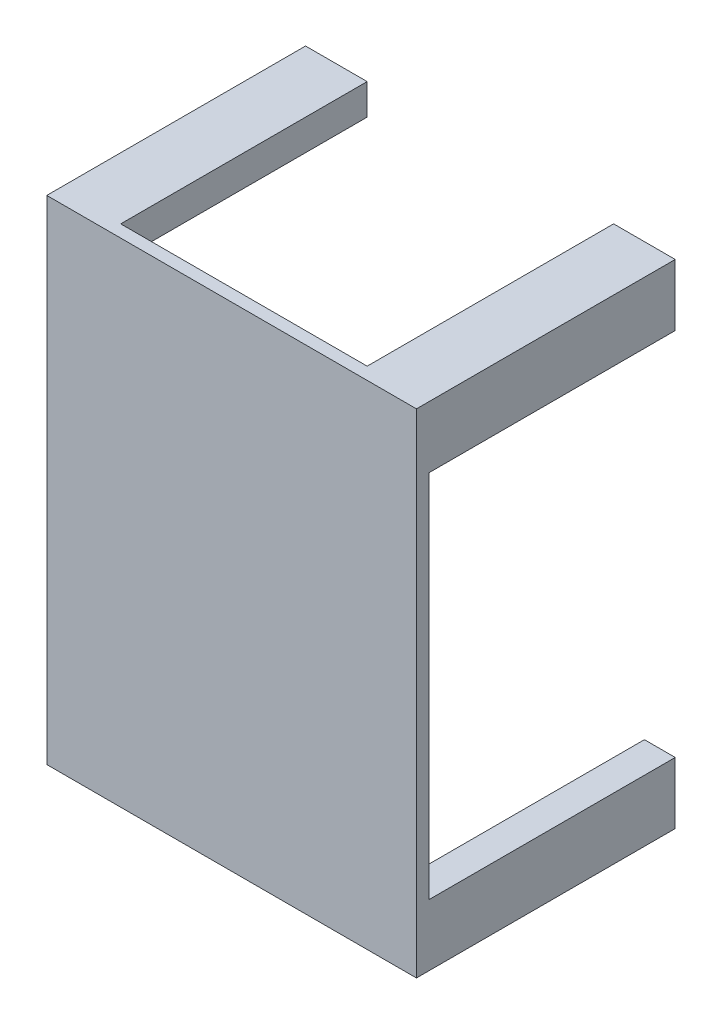
ISO-10303-21;
HEADER;
FILE_DESCRIPTION(('STEP AP214'),'2;1');
FILE_NAME('part.step','',(''),(''),'','','');
FILE_SCHEMA(('AUTOMOTIVE_DESIGN { 1 0 10303 214 1 1 1 1 }'));
ENDSEC;
DATA;
#1=APPLICATION_CONTEXT('core data for automotive mechanical design processes');
#2=APPLICATION_PROTOCOL_DEFINITION('international standard','automotive_design',2000,#1);
#3=PRODUCT_CONTEXT('',#1,'mechanical');
#4=PRODUCT('Part','Part','',(#3));
#5=PRODUCT_RELATED_PRODUCT_CATEGORY('part','',(#4));
#6=PRODUCT_DEFINITION_FORMATION('','',#4);
#7=PRODUCT_DEFINITION_CONTEXT('part definition',#1,'design');
#8=PRODUCT_DEFINITION('design','',#6,#7);
#9=PRODUCT_DEFINITION_SHAPE('','',#8);
#10=(LENGTH_UNIT() NAMED_UNIT(*) SI_UNIT(.MILLI.,.METRE.));
#11=(NAMED_UNIT(*) PLANE_ANGLE_UNIT() SI_UNIT($,.RADIAN.));
#12=(NAMED_UNIT(*) SI_UNIT($,.STERADIAN.) SOLID_ANGLE_UNIT());
#13=UNCERTAINTY_MEASURE_WITH_UNIT(LENGTH_MEASURE(1.E-05),#10,'distance_accuracy_value','');
#14=(GEOMETRIC_REPRESENTATION_CONTEXT(3) GLOBAL_UNCERTAINTY_ASSIGNED_CONTEXT((#13)) GLOBAL_UNIT_ASSIGNED_CONTEXT((#10,
#11,#12)) REPRESENTATION_CONTEXT('',''));
#15=CARTESIAN_POINT('',(0.,0.,0.));
#16=DIRECTION('',(0.,0.,1.));
#17=DIRECTION('',(1.,0.,0.));
#18=AXIS2_PLACEMENT_3D('',#15,#16,#17);
#19=CARTESIAN_POINT('',(0.,0.,0.));
#20=DIRECTION('',(0.,0.,1.));
#21=DIRECTION('',(1.,0.,0.));
#22=AXIS2_PLACEMENT_3D('',#19,#20,#21);
#23=PLANE('',#22);
#24=DIRECTION('',(1.,0.,0.));
#25=VECTOR('',#24,1.);
#26=CARTESIAN_POINT('',(55.,10.,0.));
#27=LINE('',#26,#25);
#28=CARTESIAN_POINT('',(55.,10.,0.));
#29=VERTEX_POINT('',#28);
#30=CARTESIAN_POINT('',(60.,10.,0.));
#31=VERTEX_POINT('',#30);
#32=EDGE_CURVE('E55',#29,#31,#27,.T.);
#33=ORIENTED_EDGE('',*,*,#32,.F.);
#34=DIRECTION('',(0.,1.,0.));
#35=VECTOR('',#34,1.);
#36=CARTESIAN_POINT('',(55.,5.,0.));
#37=LINE('',#36,#35);
#38=CARTESIAN_POINT('',(55.,5.,0.));
#39=VERTEX_POINT('',#38);
#40=EDGE_CURVE('E203',#39,#29,#37,.T.);
#41=ORIENTED_EDGE('',*,*,#40,.F.);
#42=DIRECTION('',(1.,0.,0.));
#43=VECTOR('',#42,1.);
#44=CARTESIAN_POINT('',(50.,5.,0.));
#45=LINE('',#44,#43);
#46=CARTESIAN_POINT('',(50.,5.,0.));
#47=VERTEX_POINT('',#46);
#48=EDGE_CURVE('E213',#47,#39,#45,.T.);
#49=ORIENTED_EDGE('',*,*,#48,.F.);
#50=DIRECTION('',(0.,1.,0.));
#51=VECTOR('',#50,1.);
#52=CARTESIAN_POINT('',(50.,0.,0.));
#53=LINE('',#52,#51);
#54=CARTESIAN_POINT('',(50.,0.,0.));
#55=VERTEX_POINT('',#54);
#56=EDGE_CURVE('E226',#55,#47,#53,.T.);
#57=ORIENTED_EDGE('',*,*,#56,.F.);
#58=DIRECTION('',(1.,0.,0.));
#59=VECTOR('',#58,1.);
#60=CARTESIAN_POINT('',(0.,0.,0.));
#61=LINE('',#60,#59);
#62=CARTESIAN_POINT('',(10.,0.,0.));
#63=VERTEX_POINT('',#62);
#64=EDGE_CURVE('E432',#63,#55,#61,.T.);
#65=ORIENTED_EDGE('',*,*,#64,.F.);
#66=DIRECTION('',(0.,1.,0.));
#67=VECTOR('',#66,1.);
#68=CARTESIAN_POINT('',(10.,0.,0.));
#69=LINE('',#68,#67);
#70=CARTESIAN_POINT('',(10.,5.,0.));
#71=VERTEX_POINT('',#70);
#72=EDGE_CURVE('E63',#63,#71,#69,.T.);
#73=ORIENTED_EDGE('',*,*,#72,.T.);
#74=DIRECTION('',(-1.,0.,0.));
#75=VECTOR('',#74,1.);
#76=CARTESIAN_POINT('',(10.,5.,0.));
#77=LINE('',#76,#75);
#78=CARTESIAN_POINT('',(5.,5.,0.));
#79=VERTEX_POINT('',#78);
#80=EDGE_CURVE('E268',#71,#79,#77,.T.);
#81=ORIENTED_EDGE('',*,*,#80,.T.);
#82=DIRECTION('',(0.,1.,0.));
#83=VECTOR('',#82,1.);
#84=CARTESIAN_POINT('',(5.,5.,0.));
#85=LINE('',#84,#83);
#86=CARTESIAN_POINT('',(5.,10.,0.));
#87=VERTEX_POINT('',#86);
#88=EDGE_CURVE('E264',#79,#87,#85,.T.);
#89=ORIENTED_EDGE('',*,*,#88,.T.);
#90=DIRECTION('',(-1.,0.,0.));
#91=VECTOR('',#90,1.);
#92=CARTESIAN_POINT('',(5.,10.,0.));
#93=LINE('',#92,#91);
#94=CARTESIAN_POINT('',(0.,10.,0.));
#95=VERTEX_POINT('',#94);
#96=EDGE_CURVE('E275',#87,#95,#93,.T.);
#97=ORIENTED_EDGE('',*,*,#96,.T.);
#98=DIRECTION('',(0.,-1.,0.));
#99=VECTOR('',#98,1.);
#100=CARTESIAN_POINT('',(0.,80.,0.));
#101=LINE('',#100,#99);
#102=CARTESIAN_POINT('',(0.,70.,0.));
#103=VERTEX_POINT('',#102);
#104=EDGE_CURVE('E401',#103,#95,#101,.T.);
#105=ORIENTED_EDGE('',*,*,#104,.F.);
#106=DIRECTION('',(-1.,0.,0.));
#107=VECTOR('',#106,1.);
#108=CARTESIAN_POINT('',(5.,70.,0.));
#109=LINE('',#108,#107);
#110=CARTESIAN_POINT('',(5.,70.,0.));
#111=VERTEX_POINT('',#110);
#112=EDGE_CURVE('E335',#111,#103,#109,.T.);
#113=ORIENTED_EDGE('',*,*,#112,.F.);
#114=DIRECTION('',(0.,-1.,0.));
#115=VECTOR('',#114,1.);
#116=CARTESIAN_POINT('',(5.,75.,0.));
#117=LINE('',#116,#115);
#118=CARTESIAN_POINT('',(5.,75.,0.));
#119=VERTEX_POINT('',#118);
#120=EDGE_CURVE('E322',#119,#111,#117,.T.);
#121=ORIENTED_EDGE('',*,*,#120,.F.);
#122=DIRECTION('',(-1.,0.,0.));
#123=VECTOR('',#122,1.);
#124=CARTESIAN_POINT('',(10.,75.,0.));
#125=LINE('',#124,#123);
#126=CARTESIAN_POINT('',(10.,75.,0.));
#127=VERTEX_POINT('',#126);
#128=EDGE_CURVE('E326',#127,#119,#125,.T.);
#129=ORIENTED_EDGE('',*,*,#128,.F.);
#130=DIRECTION('',(0.,-1.,0.));
#131=VECTOR('',#130,1.);
#132=CARTESIAN_POINT('',(10.,80.,0.));
#133=LINE('',#132,#131);
#134=CARTESIAN_POINT('',(10.,80.,0.));
#135=VERTEX_POINT('',#134);
#136=EDGE_CURVE('E331',#135,#127,#133,.T.);
#137=ORIENTED_EDGE('',*,*,#136,.F.);
#138=DIRECTION('',(-1.,0.,0.));
#139=VECTOR('',#138,1.);
#140=CARTESIAN_POINT('',(60.,80.,0.));
#141=LINE('',#140,#139);
#142=CARTESIAN_POINT('',(50.,80.,0.));
#143=VERTEX_POINT('',#142);
#144=EDGE_CURVE('E419',#143,#135,#141,.T.);
#145=ORIENTED_EDGE('',*,*,#144,.F.);
#146=DIRECTION('',(0.,-1.,0.));
#147=VECTOR('',#146,1.);
#148=CARTESIAN_POINT('',(50.,80.,0.));
#149=LINE('',#148,#147);
#150=CARTESIAN_POINT('',(50.,75.,0.));
#151=VERTEX_POINT('',#150);
#152=EDGE_CURVE('E386',#143,#151,#149,.T.);
#153=ORIENTED_EDGE('',*,*,#152,.T.);
#154=DIRECTION('',(1.,0.,0.));
#155=VECTOR('',#154,1.);
#156=CARTESIAN_POINT('',(50.,75.,0.));
#157=LINE('',#156,#155);
#158=CARTESIAN_POINT('',(55.,75.,0.));
#159=VERTEX_POINT('',#158);
#160=EDGE_CURVE('E390',#151,#159,#157,.T.);
#161=ORIENTED_EDGE('',*,*,#160,.T.);
#162=DIRECTION('',(0.,-1.,0.));
#163=VECTOR('',#162,1.);
#164=CARTESIAN_POINT('',(55.,75.,0.));
#165=LINE('',#164,#163);
#166=CARTESIAN_POINT('',(55.,70.,0.));
#167=VERTEX_POINT('',#166);
#168=EDGE_CURVE('E363',#159,#167,#165,.T.);
#169=ORIENTED_EDGE('',*,*,#168,.T.);
#170=DIRECTION('',(1.,0.,0.));
#171=VECTOR('',#170,1.);
#172=CARTESIAN_POINT('',(55.,70.,0.));
#173=LINE('',#172,#171);
#174=CARTESIAN_POINT('',(60.,70.,0.));
#175=VERTEX_POINT('',#174);
#176=EDGE_CURVE('E339',#167,#175,#173,.T.);
#177=ORIENTED_EDGE('',*,*,#176,.T.);
#178=DIRECTION('',(0.,1.,0.));
#179=VECTOR('',#178,1.);
#180=CARTESIAN_POINT('',(60.,0.,0.));
#181=LINE('',#180,#179);
#182=EDGE_CURVE('E223',#31,#175,#181,.T.);
#183=ORIENTED_EDGE('',*,*,#182,.F.);
#184=EDGE_LOOP('',(#33,#41,#49,#57,#65,#73,#81,#89,#97,#105,#113,#121,#129,#137,#145,#153,#161,
#169,#177,#183));
#185=FACE_BOUND('',#184,.T.);
#186=ADVANCED_FACE('F39',(#185),#23,.F.);
#187=CARTESIAN_POINT('',(0.,80.,2.));
#188=DIRECTION('',(1.,0.,0.));
#189=DIRECTION('',(0.,0.,-1.));
#190=AXIS2_PLACEMENT_3D('',#187,#188,#189);
#191=PLANE('',#190);
#192=DIRECTION('',(0.,0.,-1.));
#193=VECTOR('',#192,1.);
#194=CARTESIAN_POINT('',(0.,80.,2.));
#195=LINE('',#194,#193);
#196=CARTESIAN_POINT('',(0.,80.,2.));
#197=VERTEX_POINT('',#196);
#198=CARTESIAN_POINT('',(0.,80.,-40.));
#199=VERTEX_POINT('',#198);
#200=EDGE_CURVE('E428',#197,#199,#195,.T.);
#201=ORIENTED_EDGE('',*,*,#200,.T.);
#202=DIRECTION('',(0.,1.,0.));
#203=VECTOR('',#202,1.);
#204=CARTESIAN_POINT('',(0.,70.,-40.));
#205=LINE('',#204,#203);
#206=CARTESIAN_POINT('',(0.,70.,-40.));
#207=VERTEX_POINT('',#206);
#208=EDGE_CURVE('E351',#207,#199,#205,.T.);
#209=ORIENTED_EDGE('',*,*,#208,.F.);
#210=DIRECTION('',(0.,0.,1.));
#211=VECTOR('',#210,1.);
#212=CARTESIAN_POINT('',(0.,70.,-40.));
#213=LINE('',#212,#211);
#214=EDGE_CURVE('E279',#207,#103,#213,.T.);
#215=ORIENTED_EDGE('',*,*,#214,.T.);
#216=ORIENTED_EDGE('',*,*,#104,.T.);
#217=DIRECTION('',(0.,0.,1.));
#218=VECTOR('',#217,1.);
#219=CARTESIAN_POINT('',(0.,10.,-40.));
#220=LINE('',#219,#218);
#221=CARTESIAN_POINT('',(0.,10.,-40.));
#222=VERTEX_POINT('',#221);
#223=EDGE_CURVE('E252',#222,#95,#220,.T.);
#224=ORIENTED_EDGE('',*,*,#223,.F.);
#225=DIRECTION('',(0.,-1.,0.));
#226=VECTOR('',#225,1.);
#227=CARTESIAN_POINT('',(0.,10.,-40.));
#228=LINE('',#227,#226);
#229=CARTESIAN_POINT('',(0.,0.,-40.));
#230=VERTEX_POINT('',#229);
#231=EDGE_CURVE('E295',#222,#230,#228,.T.);
#232=ORIENTED_EDGE('',*,*,#231,.T.);
#233=DIRECTION('',(0.,0.,-1.));
#234=VECTOR('',#233,1.);
#235=CARTESIAN_POINT('',(0.,0.,2.));
#236=LINE('',#235,#234);
#237=CARTESIAN_POINT('',(0.,0.,2.));
#238=VERTEX_POINT('',#237);
#239=EDGE_CURVE('E11',#238,#230,#236,.T.);
#240=ORIENTED_EDGE('',*,*,#239,.F.);
#241=DIRECTION('',(0.,-1.,0.));
#242=VECTOR('',#241,1.);
#243=CARTESIAN_POINT('',(0.,80.,2.));
#244=LINE('',#243,#242);
#245=EDGE_CURVE('E414',#197,#238,#244,.T.);
#246=ORIENTED_EDGE('',*,*,#245,.F.);
#247=EDGE_LOOP('',(#201,#209,#215,#216,#224,#232,#240,#246));
#248=FACE_BOUND('',#247,.T.);
#249=ADVANCED_FACE('F41',(#248),#191,.F.);
#250=CARTESIAN_POINT('',(0.,0.,2.));
#251=DIRECTION('',(0.,1.,0.));
#252=DIRECTION('',(0.,0.,1.));
#253=AXIS2_PLACEMENT_3D('',#250,#251,#252);
#254=PLANE('',#253);
#255=ORIENTED_EDGE('',*,*,#239,.T.);
#256=DIRECTION('',(1.,0.,0.));
#257=VECTOR('',#256,1.);
#258=CARTESIAN_POINT('',(0.,0.,-40.));
#259=LINE('',#258,#257);
#260=CARTESIAN_POINT('',(10.,0.,-40.));
#261=VERTEX_POINT('',#260);
#262=EDGE_CURVE('E291',#230,#261,#259,.T.);
#263=ORIENTED_EDGE('',*,*,#262,.T.);
#264=DIRECTION('',(0.,0.,1.));
#265=VECTOR('',#264,1.);
#266=CARTESIAN_POINT('',(10.,0.,-40.));
#267=LINE('',#266,#265);
#268=EDGE_CURVE('E256',#261,#63,#267,.T.);
#269=ORIENTED_EDGE('',*,*,#268,.T.);
#270=ORIENTED_EDGE('',*,*,#64,.T.);
#271=DIRECTION('',(0.,0.,1.));
#272=VECTOR('',#271,1.);
#273=CARTESIAN_POINT('',(50.,0.,-40.));
#274=LINE('',#273,#272);
#275=CARTESIAN_POINT('',(50.,0.,-40.));
#276=VERTEX_POINT('',#275);
#277=EDGE_CURVE('E457',#276,#55,#274,.T.);
#278=ORIENTED_EDGE('',*,*,#277,.F.);
#279=DIRECTION('',(-1.,0.,0.));
#280=VECTOR('',#279,1.);
#281=CARTESIAN_POINT('',(60.,0.,-40.));
#282=LINE('',#281,#280);
#283=CARTESIAN_POINT('',(60.,0.,-40.));
#284=VERTEX_POINT('',#283);
#285=EDGE_CURVE('E243',#284,#276,#282,.T.);
#286=ORIENTED_EDGE('',*,*,#285,.F.);
#287=DIRECTION('',(0.,0.,-1.));
#288=VECTOR('',#287,1.);
#289=CARTESIAN_POINT('',(60.,0.,2.));
#290=LINE('',#289,#288);
#291=CARTESIAN_POINT('',(60.,0.,2.));
#292=VERTEX_POINT('',#291);
#293=EDGE_CURVE('E48',#292,#284,#290,.T.);
#294=ORIENTED_EDGE('',*,*,#293,.F.);
#295=DIRECTION('',(1.,0.,0.));
#296=VECTOR('',#295,1.);
#297=CARTESIAN_POINT('',(0.,0.,2.));
#298=LINE('',#297,#296);
#299=EDGE_CURVE('E418',#238,#292,#298,.T.);
#300=ORIENTED_EDGE('',*,*,#299,.F.);
#301=EDGE_LOOP('',(#255,#263,#269,#270,#278,#286,#294,#300));
#302=FACE_BOUND('',#301,.T.);
#303=ADVANCED_FACE('F456',(#302),#254,.F.);
#304=CARTESIAN_POINT('',(60.,0.,2.));
#305=DIRECTION('',(-1.,0.,0.));
#306=DIRECTION('',(0.,-1.,0.));
#307=AXIS2_PLACEMENT_3D('',#304,#305,#306);
#308=PLANE('',#307);
#309=ORIENTED_EDGE('',*,*,#293,.T.);
#310=DIRECTION('',(0.,-1.,0.));
#311=VECTOR('',#310,1.);
#312=CARTESIAN_POINT('',(60.,10.,-40.));
#313=LINE('',#312,#311);
#314=CARTESIAN_POINT('',(60.,10.,-40.));
#315=VERTEX_POINT('',#314);
#316=EDGE_CURVE('E246',#315,#284,#313,.T.);
#317=ORIENTED_EDGE('',*,*,#316,.F.);
#318=DIRECTION('',(0.,0.,1.));
#319=VECTOR('',#318,1.);
#320=CARTESIAN_POINT('',(60.,10.,-40.));
#321=LINE('',#320,#319);
#322=EDGE_CURVE('E464',#315,#31,#321,.T.);
#323=ORIENTED_EDGE('',*,*,#322,.T.);
#324=ORIENTED_EDGE('',*,*,#182,.T.);
#325=DIRECTION('',(0.,0.,1.));
#326=VECTOR('',#325,1.);
#327=CARTESIAN_POINT('',(60.,70.,-40.));
#328=LINE('',#327,#326);
#329=CARTESIAN_POINT('',(60.,70.,-40.));
#330=VERTEX_POINT('',#329);
#331=EDGE_CURVE('E383',#330,#175,#328,.T.);
#332=ORIENTED_EDGE('',*,*,#331,.F.);
#333=DIRECTION('',(0.,1.,0.));
#334=VECTOR('',#333,1.);
#335=CARTESIAN_POINT('',(60.,70.,-40.));
#336=LINE('',#335,#334);
#337=CARTESIAN_POINT('',(60.,80.,-40.));
#338=VERTEX_POINT('',#337);
#339=EDGE_CURVE('E362',#330,#338,#336,.T.);
#340=ORIENTED_EDGE('',*,*,#339,.T.);
#341=DIRECTION('',(0.,0.,-1.));
#342=VECTOR('',#341,1.);
#343=CARTESIAN_POINT('',(60.,80.,2.));
#344=LINE('',#343,#342);
#345=CARTESIAN_POINT('',(60.,80.,2.));
#346=VERTEX_POINT('',#345);
#347=EDGE_CURVE('E443',#346,#338,#344,.T.);
#348=ORIENTED_EDGE('',*,*,#347,.F.);
#349=DIRECTION('',(0.,1.,0.));
#350=VECTOR('',#349,1.);
#351=CARTESIAN_POINT('',(60.,0.,2.));
#352=LINE('',#351,#350);
#353=EDGE_CURVE('E422',#292,#346,#352,.T.);
#354=ORIENTED_EDGE('',*,*,#353,.F.);
#355=EDGE_LOOP('',(#309,#317,#323,#324,#332,#340,#348,#354));
#356=FACE_BOUND('',#355,.T.);
#357=ADVANCED_FACE('F449',(#356),#308,.F.);
#358=CARTESIAN_POINT('',(60.,80.,2.));
#359=DIRECTION('',(0.,-1.,0.));
#360=DIRECTION('',(1.,0.,0.));
#361=AXIS2_PLACEMENT_3D('',#358,#359,#360);
#362=PLANE('',#361);
#363=ORIENTED_EDGE('',*,*,#347,.T.);
#364=DIRECTION('',(-1.,0.,0.));
#365=VECTOR('',#364,1.);
#366=CARTESIAN_POINT('',(60.,80.,-40.));
#367=LINE('',#366,#365);
#368=CARTESIAN_POINT('',(50.,80.,-40.));
#369=VERTEX_POINT('',#368);
#370=EDGE_CURVE('E367',#338,#369,#367,.T.);
#371=ORIENTED_EDGE('',*,*,#370,.T.);
#372=DIRECTION('',(0.,0.,1.));
#373=VECTOR('',#372,1.);
#374=CARTESIAN_POINT('',(50.,80.,-40.));
#375=LINE('',#374,#373);
#376=EDGE_CURVE('E408',#369,#143,#375,.T.);
#377=ORIENTED_EDGE('',*,*,#376,.T.);
#378=ORIENTED_EDGE('',*,*,#144,.T.);
#379=DIRECTION('',(0.,0.,1.));
#380=VECTOR('',#379,1.);
#381=CARTESIAN_POINT('',(10.,80.,-40.));
#382=LINE('',#381,#380);
#383=CARTESIAN_POINT('',(10.,80.,-40.));
#384=VERTEX_POINT('',#383);
#385=EDGE_CURVE('E305',#384,#135,#382,.T.);
#386=ORIENTED_EDGE('',*,*,#385,.F.);
#387=DIRECTION('',(1.,0.,0.));
#388=VECTOR('',#387,1.);
#389=CARTESIAN_POINT('',(0.,80.,-40.));
#390=LINE('',#389,#388);
#391=EDGE_CURVE('E348',#199,#384,#390,.T.);
#392=ORIENTED_EDGE('',*,*,#391,.F.);
#393=ORIENTED_EDGE('',*,*,#200,.F.);
#394=DIRECTION('',(-1.,0.,0.));
#395=VECTOR('',#394,1.);
#396=CARTESIAN_POINT('',(60.,80.,2.));
#397=LINE('',#396,#395);
#398=EDGE_CURVE('E425',#346,#197,#397,.T.);
#399=ORIENTED_EDGE('',*,*,#398,.F.);
#400=EDGE_LOOP('',(#363,#371,#377,#378,#386,#392,#393,#399));
#401=FACE_BOUND('',#400,.T.);
#402=ADVANCED_FACE('F496',(#401),#362,.F.);
#403=CARTESIAN_POINT('',(0.,0.,2.));
#404=DIRECTION('',(0.,0.,1.));
#405=DIRECTION('',(1.,0.,0.));
#406=AXIS2_PLACEMENT_3D('',#403,#404,#405);
#407=PLANE('',#406);
#408=ORIENTED_EDGE('',*,*,#245,.T.);
#409=ORIENTED_EDGE('',*,*,#299,.T.);
#410=ORIENTED_EDGE('',*,*,#353,.T.);
#411=ORIENTED_EDGE('',*,*,#398,.T.);
#412=EDGE_LOOP('',(#408,#409,#410,#411));
#413=FACE_BOUND('',#412,.T.);
#414=ADVANCED_FACE('F500',(#413),#407,.T.);
#415=CARTESIAN_POINT('',(55.,70.,-40.));
#416=DIRECTION('',(0.,-1.,0.));
#417=DIRECTION('',(0.,0.,-1.));
#418=AXIS2_PLACEMENT_3D('',#415,#416,#417);
#419=PLANE('',#418);
#420=ORIENTED_EDGE('',*,*,#176,.F.);
#421=DIRECTION('',(0.,0.,1.));
#422=VECTOR('',#421,1.);
#423=CARTESIAN_POINT('',(55.,70.,-40.));
#424=LINE('',#423,#422);
#425=CARTESIAN_POINT('',(55.,70.,-40.));
#426=VERTEX_POINT('',#425);
#427=EDGE_CURVE('E397',#426,#167,#424,.T.);
#428=ORIENTED_EDGE('',*,*,#427,.F.);
#429=DIRECTION('',(1.,0.,0.));
#430=VECTOR('',#429,1.);
#431=CARTESIAN_POINT('',(55.,70.,-40.));
#432=LINE('',#431,#430);
#433=EDGE_CURVE('E358',#426,#330,#432,.T.);
#434=ORIENTED_EDGE('',*,*,#433,.T.);
#435=ORIENTED_EDGE('',*,*,#331,.T.);
#436=EDGE_LOOP('',(#420,#428,#434,#435));
#437=FACE_BOUND('',#436,.T.);
#438=ADVANCED_FACE('F481',(#437),#419,.T.);
#439=CARTESIAN_POINT('',(55.,75.,-40.));
#440=DIRECTION('',(-1.,0.,0.));
#441=DIRECTION('',(0.,0.,1.));
#442=AXIS2_PLACEMENT_3D('',#439,#440,#441);
#443=PLANE('',#442);
#444=ORIENTED_EDGE('',*,*,#168,.F.);
#445=DIRECTION('',(0.,0.,1.));
#446=VECTOR('',#445,1.);
#447=CARTESIAN_POINT('',(55.,75.,-40.));
#448=LINE('',#447,#446);
#449=CARTESIAN_POINT('',(55.,75.,-40.));
#450=VERTEX_POINT('',#449);
#451=EDGE_CURVE('E402',#450,#159,#448,.T.);
#452=ORIENTED_EDGE('',*,*,#451,.F.);
#453=DIRECTION('',(0.,-1.,0.));
#454=VECTOR('',#453,1.);
#455=CARTESIAN_POINT('',(55.,75.,-40.));
#456=LINE('',#455,#454);
#457=EDGE_CURVE('E379',#450,#426,#456,.T.);
#458=ORIENTED_EDGE('',*,*,#457,.T.);
#459=ORIENTED_EDGE('',*,*,#427,.T.);
#460=EDGE_LOOP('',(#444,#452,#458,#459));
#461=FACE_BOUND('',#460,.T.);
#462=ADVANCED_FACE('F486',(#461),#443,.T.);
#463=CARTESIAN_POINT('',(50.,75.,-40.));
#464=DIRECTION('',(0.,-1.,0.));
#465=DIRECTION('',(0.,0.,-1.));
#466=AXIS2_PLACEMENT_3D('',#463,#464,#465);
#467=PLANE('',#466);
#468=ORIENTED_EDGE('',*,*,#160,.F.);
#469=DIRECTION('',(0.,0.,1.));
#470=VECTOR('',#469,1.);
#471=CARTESIAN_POINT('',(50.,75.,-40.));
#472=LINE('',#471,#470);
#473=CARTESIAN_POINT('',(50.,75.,-40.));
#474=VERTEX_POINT('',#473);
#475=EDGE_CURVE('E405',#474,#151,#472,.T.);
#476=ORIENTED_EDGE('',*,*,#475,.F.);
#477=DIRECTION('',(1.,0.,0.));
#478=VECTOR('',#477,1.);
#479=CARTESIAN_POINT('',(50.,75.,-40.));
#480=LINE('',#479,#478);
#481=EDGE_CURVE('E375',#474,#450,#480,.T.);
#482=ORIENTED_EDGE('',*,*,#481,.T.);
#483=ORIENTED_EDGE('',*,*,#451,.T.);
#484=EDGE_LOOP('',(#468,#476,#482,#483));
#485=FACE_BOUND('',#484,.T.);
#486=ADVANCED_FACE('F569',(#485),#467,.T.);
#487=CARTESIAN_POINT('',(50.,80.,-40.));
#488=DIRECTION('',(-1.,0.,0.));
#489=DIRECTION('',(0.,0.,1.));
#490=AXIS2_PLACEMENT_3D('',#487,#488,#489);
#491=PLANE('',#490);
#492=ORIENTED_EDGE('',*,*,#152,.F.);
#493=ORIENTED_EDGE('',*,*,#376,.F.);
#494=DIRECTION('',(0.,-1.,0.));
#495=VECTOR('',#494,1.);
#496=CARTESIAN_POINT('',(50.,80.,-40.));
#497=LINE('',#496,#495);
#498=EDGE_CURVE('E371',#369,#474,#497,.T.);
#499=ORIENTED_EDGE('',*,*,#498,.T.);
#500=ORIENTED_EDGE('',*,*,#475,.T.);
#501=EDGE_LOOP('',(#492,#493,#499,#500));
#502=FACE_BOUND('',#501,.T.);
#503=ADVANCED_FACE('F576',(#502),#491,.T.);
#504=CARTESIAN_POINT('',(0.,0.,-40.));
#505=DIRECTION('',(0.,0.,1.));
#506=DIRECTION('',(1.,0.,0.));
#507=AXIS2_PLACEMENT_3D('',#504,#505,#506);
#508=PLANE('',#507);
#509=ORIENTED_EDGE('',*,*,#433,.F.);
#510=ORIENTED_EDGE('',*,*,#457,.F.);
#511=ORIENTED_EDGE('',*,*,#481,.F.);
#512=ORIENTED_EDGE('',*,*,#498,.F.);
#513=ORIENTED_EDGE('',*,*,#370,.F.);
#514=ORIENTED_EDGE('',*,*,#339,.F.);
#515=EDGE_LOOP('',(#509,#510,#511,#512,#513,#514));
#516=FACE_BOUND('',#515,.T.);
#517=ADVANCED_FACE('F489',(#516),#508,.F.);
#518=CARTESIAN_POINT('',(5.,70.,-40.));
#519=DIRECTION('',(0.,1.,0.));
#520=DIRECTION('',(0.,0.,1.));
#521=AXIS2_PLACEMENT_3D('',#518,#519,#520);
#522=PLANE('',#521);
#523=ORIENTED_EDGE('',*,*,#112,.T.);
#524=ORIENTED_EDGE('',*,*,#214,.F.);
#525=DIRECTION('',(-1.,0.,0.));
#526=VECTOR('',#525,1.);
#527=CARTESIAN_POINT('',(5.,70.,-40.));
#528=LINE('',#527,#526);
#529=CARTESIAN_POINT('',(5.,70.,-40.));
#530=VERTEX_POINT('',#529);
#531=EDGE_CURVE('E327',#530,#207,#528,.T.);
#532=ORIENTED_EDGE('',*,*,#531,.F.);
#533=DIRECTION('',(0.,0.,1.));
#534=VECTOR('',#533,1.);
#535=CARTESIAN_POINT('',(5.,70.,-40.));
#536=LINE('',#535,#534);
#537=EDGE_CURVE('E317',#530,#111,#536,.T.);
#538=ORIENTED_EDGE('',*,*,#537,.T.);
#539=EDGE_LOOP('',(#523,#524,#532,#538));
#540=FACE_BOUND('',#539,.T.);
#541=ADVANCED_FACE('F591',(#540),#522,.F.);
#542=CARTESIAN_POINT('',(10.,80.,-40.));
#543=DIRECTION('',(-1.,0.,0.));
#544=DIRECTION('',(0.,0.,1.));
#545=AXIS2_PLACEMENT_3D('',#542,#543,#544);
#546=PLANE('',#545);
#547=ORIENTED_EDGE('',*,*,#136,.T.);
#548=DIRECTION('',(0.,0.,1.));
#549=VECTOR('',#548,1.);
#550=CARTESIAN_POINT('',(10.,75.,-40.));
#551=LINE('',#550,#549);
#552=CARTESIAN_POINT('',(10.,75.,-40.));
#553=VERTEX_POINT('',#552);
#554=EDGE_CURVE('E309',#553,#127,#551,.T.);
#555=ORIENTED_EDGE('',*,*,#554,.F.);
#556=DIRECTION('',(0.,-1.,0.));
#557=VECTOR('',#556,1.);
#558=CARTESIAN_POINT('',(10.,80.,-40.));
#559=LINE('',#558,#557);
#560=EDGE_CURVE('E345',#384,#553,#559,.T.);
#561=ORIENTED_EDGE('',*,*,#560,.F.);
#562=ORIENTED_EDGE('',*,*,#385,.T.);
#563=EDGE_LOOP('',(#547,#555,#561,#562));
#564=FACE_BOUND('',#563,.T.);
#565=ADVANCED_FACE('F598',(#564),#546,.F.);
#566=CARTESIAN_POINT('',(10.,75.,-40.));
#567=DIRECTION('',(0.,1.,0.));
#568=DIRECTION('',(0.,0.,1.));
#569=AXIS2_PLACEMENT_3D('',#566,#567,#568);
#570=PLANE('',#569);
#571=ORIENTED_EDGE('',*,*,#128,.T.);
#572=DIRECTION('',(0.,0.,1.));
#573=VECTOR('',#572,1.);
#574=CARTESIAN_POINT('',(5.,75.,-40.));
#575=LINE('',#574,#573);
#576=CARTESIAN_POINT('',(5.,75.,-40.));
#577=VERTEX_POINT('',#576);
#578=EDGE_CURVE('E313',#577,#119,#575,.T.);
#579=ORIENTED_EDGE('',*,*,#578,.F.);
#580=DIRECTION('',(-1.,0.,0.));
#581=VECTOR('',#580,1.);
#582=CARTESIAN_POINT('',(10.,75.,-40.));
#583=LINE('',#582,#581);
#584=EDGE_CURVE('E342',#553,#577,#583,.T.);
#585=ORIENTED_EDGE('',*,*,#584,.F.);
#586=ORIENTED_EDGE('',*,*,#554,.T.);
#587=EDGE_LOOP('',(#571,#579,#585,#586));
#588=FACE_BOUND('',#587,.T.);
#589=ADVANCED_FACE('F606',(#588),#570,.F.);
#590=CARTESIAN_POINT('',(5.,75.,-40.));
#591=DIRECTION('',(-1.,0.,0.));
#592=DIRECTION('',(0.,-1.,0.));
#593=AXIS2_PLACEMENT_3D('',#590,#591,#592);
#594=PLANE('',#593);
#595=ORIENTED_EDGE('',*,*,#120,.T.);
#596=ORIENTED_EDGE('',*,*,#537,.F.);
#597=DIRECTION('',(0.,-1.,0.));
#598=VECTOR('',#597,1.);
#599=CARTESIAN_POINT('',(5.,75.,-40.));
#600=LINE('',#599,#598);
#601=EDGE_CURVE('E321',#577,#530,#600,.T.);
#602=ORIENTED_EDGE('',*,*,#601,.F.);
#603=ORIENTED_EDGE('',*,*,#578,.T.);
#604=EDGE_LOOP('',(#595,#596,#602,#603));
#605=FACE_BOUND('',#604,.T.);
#606=ADVANCED_FACE('F614',(#605),#594,.F.);
#607=CARTESIAN_POINT('',(0.,0.,-40.));
#608=DIRECTION('',(0.,0.,-1.));
#609=DIRECTION('',(-1.,0.,0.));
#610=AXIS2_PLACEMENT_3D('',#607,#608,#609);
#611=PLANE('',#610);
#612=ORIENTED_EDGE('',*,*,#531,.T.);
#613=ORIENTED_EDGE('',*,*,#208,.T.);
#614=ORIENTED_EDGE('',*,*,#391,.T.);
#615=ORIENTED_EDGE('',*,*,#560,.T.);
#616=ORIENTED_EDGE('',*,*,#584,.T.);
#617=ORIENTED_EDGE('',*,*,#601,.T.);
#618=EDGE_LOOP('',(#612,#613,#614,#615,#616,#617));
#619=FACE_BOUND('',#618,.T.);
#620=ADVANCED_FACE('F622',(#619),#611,.T.);
#621=CARTESIAN_POINT('',(5.,10.,-40.));
#622=DIRECTION('',(0.,1.,0.));
#623=DIRECTION('',(0.,0.,1.));
#624=AXIS2_PLACEMENT_3D('',#621,#622,#623);
#625=PLANE('',#624);
#626=ORIENTED_EDGE('',*,*,#96,.F.);
#627=DIRECTION('',(0.,0.,1.));
#628=VECTOR('',#627,1.);
#629=CARTESIAN_POINT('',(5.,10.,-40.));
#630=LINE('',#629,#628);
#631=CARTESIAN_POINT('',(5.,10.,-40.));
#632=VERTEX_POINT('',#631);
#633=EDGE_CURVE('E225',#632,#87,#630,.T.);
#634=ORIENTED_EDGE('',*,*,#633,.F.);
#635=DIRECTION('',(-1.,0.,0.));
#636=VECTOR('',#635,1.);
#637=CARTESIAN_POINT('',(5.,10.,-40.));
#638=LINE('',#637,#636);
#639=EDGE_CURVE('E269',#632,#222,#638,.T.);
#640=ORIENTED_EDGE('',*,*,#639,.T.);
#641=ORIENTED_EDGE('',*,*,#223,.T.);
#642=EDGE_LOOP('',(#626,#634,#640,#641));
#643=FACE_BOUND('',#642,.T.);
#644=ADVANCED_FACE('F512',(#643),#625,.T.);
#645=CARTESIAN_POINT('',(5.,5.,-40.));
#646=DIRECTION('',(1.,0.,0.));
#647=DIRECTION('',(0.,0.,-1.));
#648=AXIS2_PLACEMENT_3D('',#645,#646,#647);
#649=PLANE('',#648);
#650=ORIENTED_EDGE('',*,*,#88,.F.);
#651=DIRECTION('',(0.,0.,1.));
#652=VECTOR('',#651,1.);
#653=CARTESIAN_POINT('',(5.,5.,-40.));
#654=LINE('',#653,#652);
#655=CARTESIAN_POINT('',(5.,5.,-40.));
#656=VERTEX_POINT('',#655);
#657=EDGE_CURVE('E230',#656,#79,#654,.T.);
#658=ORIENTED_EDGE('',*,*,#657,.F.);
#659=DIRECTION('',(0.,1.,0.));
#660=VECTOR('',#659,1.);
#661=CARTESIAN_POINT('',(5.,5.,-40.));
#662=LINE('',#661,#660);
#663=EDGE_CURVE('E255',#656,#632,#662,.T.);
#664=ORIENTED_EDGE('',*,*,#663,.T.);
#665=ORIENTED_EDGE('',*,*,#633,.T.);
#666=EDGE_LOOP('',(#650,#658,#664,#665));
#667=FACE_BOUND('',#666,.T.);
#668=ADVANCED_FACE('F516',(#667),#649,.T.);
#669=CARTESIAN_POINT('',(10.,5.,-40.));
#670=DIRECTION('',(0.,1.,0.));
#671=DIRECTION('',(0.,0.,1.));
#672=AXIS2_PLACEMENT_3D('',#669,#670,#671);
#673=PLANE('',#672);
#674=ORIENTED_EDGE('',*,*,#80,.F.);
#675=DIRECTION('',(0.,0.,1.));
#676=VECTOR('',#675,1.);
#677=CARTESIAN_POINT('',(10.,5.,-40.));
#678=LINE('',#677,#676);
#679=CARTESIAN_POINT('',(10.,5.,-40.));
#680=VERTEX_POINT('',#679);
#681=EDGE_CURVE('E259',#680,#71,#678,.T.);
#682=ORIENTED_EDGE('',*,*,#681,.F.);
#683=DIRECTION('',(-1.,0.,0.));
#684=VECTOR('',#683,1.);
#685=CARTESIAN_POINT('',(10.,5.,-40.));
#686=LINE('',#685,#684);
#687=EDGE_CURVE('E283',#680,#656,#686,.T.);
#688=ORIENTED_EDGE('',*,*,#687,.T.);
#689=ORIENTED_EDGE('',*,*,#657,.T.);
#690=EDGE_LOOP('',(#674,#682,#688,#689));
#691=FACE_BOUND('',#690,.T.);
#692=ADVANCED_FACE('F520',(#691),#673,.T.);
#693=CARTESIAN_POINT('',(10.,0.,-40.));
#694=DIRECTION('',(1.,0.,0.));
#695=DIRECTION('',(0.,0.,-1.));
#696=AXIS2_PLACEMENT_3D('',#693,#694,#695);
#697=PLANE('',#696);
#698=ORIENTED_EDGE('',*,*,#72,.F.);
#699=ORIENTED_EDGE('',*,*,#268,.F.);
#700=DIRECTION('',(0.,1.,0.));
#701=VECTOR('',#700,1.);
#702=CARTESIAN_POINT('',(10.,0.,-40.));
#703=LINE('',#702,#701);
#704=EDGE_CURVE('E287',#261,#680,#703,.T.);
#705=ORIENTED_EDGE('',*,*,#704,.T.);
#706=ORIENTED_EDGE('',*,*,#681,.T.);
#707=EDGE_LOOP('',(#698,#699,#705,#706));
#708=FACE_BOUND('',#707,.T.);
#709=ADVANCED_FACE('F519',(#708),#697,.T.);
#710=CARTESIAN_POINT('',(0.,0.,-40.));
#711=DIRECTION('',(0.,0.,1.));
#712=DIRECTION('',(1.,0.,0.));
#713=AXIS2_PLACEMENT_3D('',#710,#711,#712);
#714=PLANE('',#713);
#715=ORIENTED_EDGE('',*,*,#639,.F.);
#716=ORIENTED_EDGE('',*,*,#663,.F.);
#717=ORIENTED_EDGE('',*,*,#687,.F.);
#718=ORIENTED_EDGE('',*,*,#704,.F.);
#719=ORIENTED_EDGE('',*,*,#262,.F.);
#720=ORIENTED_EDGE('',*,*,#231,.F.);
#721=EDGE_LOOP('',(#715,#716,#717,#718,#719,#720));
#722=FACE_BOUND('',#721,.T.);
#723=ADVANCED_FACE('F508',(#722),#714,.F.);
#724=CARTESIAN_POINT('',(55.,10.,-40.));
#725=DIRECTION('',(0.,-1.,0.));
#726=DIRECTION('',(0.,0.,-1.));
#727=AXIS2_PLACEMENT_3D('',#724,#725,#726);
#728=PLANE('',#727);
#729=ORIENTED_EDGE('',*,*,#32,.T.);
#730=ORIENTED_EDGE('',*,*,#322,.F.);
#731=DIRECTION('',(1.,0.,0.));
#732=VECTOR('',#731,1.);
#733=CARTESIAN_POINT('',(55.,10.,-40.));
#734=LINE('',#733,#732);
#735=CARTESIAN_POINT('',(55.,10.,-40.));
#736=VERTEX_POINT('',#735);
#737=EDGE_CURVE('E214',#736,#315,#734,.T.);
#738=ORIENTED_EDGE('',*,*,#737,.F.);
#739=DIRECTION('',(0.,0.,1.));
#740=VECTOR('',#739,1.);
#741=CARTESIAN_POINT('',(55.,10.,-40.));
#742=LINE('',#741,#740);
#743=EDGE_CURVE('E206',#736,#29,#742,.T.);
#744=ORIENTED_EDGE('',*,*,#743,.T.);
#745=EDGE_LOOP('',(#729,#730,#738,#744));
#746=FACE_BOUND('',#745,.T.);
#747=ADVANCED_FACE('F216',(#746),#728,.F.);
#748=CARTESIAN_POINT('',(50.,0.,-40.));
#749=DIRECTION('',(1.,0.,0.));
#750=DIRECTION('',(0.,0.,-1.));
#751=AXIS2_PLACEMENT_3D('',#748,#749,#750);
#752=PLANE('',#751);
#753=ORIENTED_EDGE('',*,*,#56,.T.);
#754=DIRECTION('',(0.,0.,1.));
#755=VECTOR('',#754,1.);
#756=CARTESIAN_POINT('',(50.,5.,-40.));
#757=LINE('',#756,#755);
#758=CARTESIAN_POINT('',(50.,5.,-40.));
#759=VERTEX_POINT('',#758);
#760=EDGE_CURVE('E463',#759,#47,#757,.T.);
#761=ORIENTED_EDGE('',*,*,#760,.F.);
#762=DIRECTION('',(0.,1.,0.));
#763=VECTOR('',#762,1.);
#764=CARTESIAN_POINT('',(50.,0.,-40.));
#765=LINE('',#764,#763);
#766=EDGE_CURVE('E240',#276,#759,#765,.T.);
#767=ORIENTED_EDGE('',*,*,#766,.F.);
#768=ORIENTED_EDGE('',*,*,#277,.T.);
#769=EDGE_LOOP('',(#753,#761,#767,#768));
#770=FACE_BOUND('',#769,.T.);
#771=ADVANCED_FACE('F467',(#770),#752,.F.);
#772=CARTESIAN_POINT('',(50.,5.,-40.));
#773=DIRECTION('',(0.,-1.,0.));
#774=DIRECTION('',(1.,0.,0.));
#775=AXIS2_PLACEMENT_3D('',#772,#773,#774);
#776=PLANE('',#775);
#777=ORIENTED_EDGE('',*,*,#48,.T.);
#778=DIRECTION('',(0.,0.,1.));
#779=VECTOR('',#778,1.);
#780=CARTESIAN_POINT('',(55.,5.,-40.));
#781=LINE('',#780,#779);
#782=CARTESIAN_POINT('',(55.,5.,-40.));
#783=VERTEX_POINT('',#782);
#784=EDGE_CURVE('E209',#783,#39,#781,.T.);
#785=ORIENTED_EDGE('',*,*,#784,.F.);
#786=DIRECTION('',(1.,0.,0.));
#787=VECTOR('',#786,1.);
#788=CARTESIAN_POINT('',(50.,5.,-40.));
#789=LINE('',#788,#787);
#790=EDGE_CURVE('E237',#759,#783,#789,.T.);
#791=ORIENTED_EDGE('',*,*,#790,.F.);
#792=ORIENTED_EDGE('',*,*,#760,.T.);
#793=EDGE_LOOP('',(#777,#785,#791,#792));
#794=FACE_BOUND('',#793,.T.);
#795=ADVANCED_FACE('F471',(#794),#776,.F.);
#796=CARTESIAN_POINT('',(55.,5.,-40.));
#797=DIRECTION('',(1.,0.,0.));
#798=DIRECTION('',(0.,0.,-1.));
#799=AXIS2_PLACEMENT_3D('',#796,#797,#798);
#800=PLANE('',#799);
#801=ORIENTED_EDGE('',*,*,#40,.T.);
#802=ORIENTED_EDGE('',*,*,#743,.F.);
#803=DIRECTION('',(0.,1.,0.));
#804=VECTOR('',#803,1.);
#805=CARTESIAN_POINT('',(55.,5.,-40.));
#806=LINE('',#805,#804);
#807=EDGE_CURVE('E219',#783,#736,#806,.T.);
#808=ORIENTED_EDGE('',*,*,#807,.F.);
#809=ORIENTED_EDGE('',*,*,#784,.T.);
#810=EDGE_LOOP('',(#801,#802,#808,#809));
#811=FACE_BOUND('',#810,.T.);
#812=ADVANCED_FACE('F204',(#811),#800,.F.);
#813=CARTESIAN_POINT('',(0.,0.,-40.));
#814=DIRECTION('',(0.,0.,-1.));
#815=DIRECTION('',(-1.,0.,0.));
#816=AXIS2_PLACEMENT_3D('',#813,#814,#815);
#817=PLANE('',#816);
#818=ORIENTED_EDGE('',*,*,#737,.T.);
#819=ORIENTED_EDGE('',*,*,#316,.T.);
#820=ORIENTED_EDGE('',*,*,#285,.T.);
#821=ORIENTED_EDGE('',*,*,#766,.T.);
#822=ORIENTED_EDGE('',*,*,#790,.T.);
#823=ORIENTED_EDGE('',*,*,#807,.T.);
#824=EDGE_LOOP('',(#818,#819,#820,#821,#822,#823));
#825=FACE_BOUND('',#824,.T.);
#826=ADVANCED_FACE('F454',(#825),#817,.T.);
#827=CLOSED_SHELL('',(#186,#249,#303,#357,#402,#414,#438,#462,#486,#503,#517,#541,#565,#589,
#606,#620,#644,#668,#692,#709,#723,#747,#771,#795,#812,#826));
#828=MANIFOLD_SOLID_BREP('B2',#827);
#829=ADVANCED_BREP_SHAPE_REPRESENTATION('',(#18,#828),#14);
#830=SHAPE_DEFINITION_REPRESENTATION(#9,#829);
ENDSEC;
END-ISO-10303-21;
